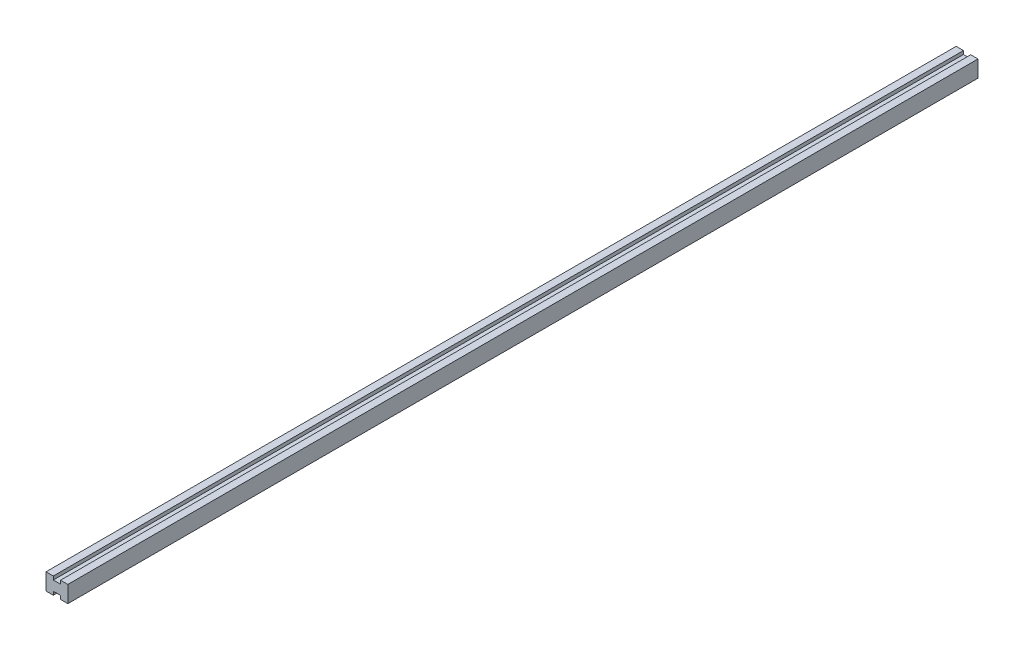
ISO-10303-21;
HEADER;
FILE_DESCRIPTION(('STEP AP214'),'2;1');
FILE_NAME('part.step','',(''),(''),'','','');
FILE_SCHEMA(('AUTOMOTIVE_DESIGN { 1 0 10303 214 1 1 1 1 }'));
ENDSEC;
DATA;
#1=APPLICATION_CONTEXT('core data for automotive mechanical design processes');
#2=APPLICATION_PROTOCOL_DEFINITION('international standard','automotive_design',2000,#1);
#3=PRODUCT_CONTEXT('',#1,'mechanical');
#4=PRODUCT('Part','Part','',(#3));
#5=PRODUCT_RELATED_PRODUCT_CATEGORY('part','',(#4));
#6=PRODUCT_DEFINITION_FORMATION('','',#4);
#7=PRODUCT_DEFINITION_CONTEXT('part definition',#1,'design');
#8=PRODUCT_DEFINITION('design','',#6,#7);
#9=PRODUCT_DEFINITION_SHAPE('','',#8);
#10=(LENGTH_UNIT() NAMED_UNIT(*) SI_UNIT(.MILLI.,.METRE.));
#11=(NAMED_UNIT(*) PLANE_ANGLE_UNIT() SI_UNIT($,.RADIAN.));
#12=(NAMED_UNIT(*) SI_UNIT($,.STERADIAN.) SOLID_ANGLE_UNIT());
#13=UNCERTAINTY_MEASURE_WITH_UNIT(LENGTH_MEASURE(1.E-05),#10,'distance_accuracy_value','');
#14=(GEOMETRIC_REPRESENTATION_CONTEXT(3) GLOBAL_UNCERTAINTY_ASSIGNED_CONTEXT((#13)) GLOBAL_UNIT_ASSIGNED_CONTEXT((#10,
#11,#12)) REPRESENTATION_CONTEXT('',''));
#15=CARTESIAN_POINT('',(0.,0.,0.));
#16=DIRECTION('',(0.,0.,1.));
#17=DIRECTION('',(1.,0.,0.));
#18=AXIS2_PLACEMENT_3D('',#15,#16,#17);
#19=CARTESIAN_POINT('',(-1.2,2.75,300.));
#20=DIRECTION('',(1.,0.,0.));
#21=DIRECTION('',(0.,1.,0.));
#22=AXIS2_PLACEMENT_3D('',#19,#20,#21);
#23=PLANE('',#22);
#24=DIRECTION('',(0.,-1.,0.));
#25=VECTOR('',#24,1.);
#26=CARTESIAN_POINT('',(-1.2,2.75,0.));
#27=LINE('',#26,#25);
#28=CARTESIAN_POINT('',(-1.2,2.75,0.));
#29=VERTEX_POINT('',#28);
#30=CARTESIAN_POINT('',(-1.2,1.6,0.));
#31=VERTEX_POINT('',#30);
#32=EDGE_CURVE('E155',#29,#31,#27,.T.);
#33=ORIENTED_EDGE('',*,*,#32,.F.);
#34=DIRECTION('',(0.,0.,-1.));
#35=VECTOR('',#34,1.);
#36=CARTESIAN_POINT('',(-1.2,2.75,300.));
#37=LINE('',#36,#35);
#38=CARTESIAN_POINT('',(-1.2,2.75,300.));
#39=VERTEX_POINT('',#38);
#40=EDGE_CURVE('E11',#39,#29,#37,.T.);
#41=ORIENTED_EDGE('',*,*,#40,.F.);
#42=DIRECTION('',(0.,-1.,0.));
#43=VECTOR('',#42,1.);
#44=CARTESIAN_POINT('',(-1.2,2.75,300.));
#45=LINE('',#44,#43);
#46=CARTESIAN_POINT('',(-1.2,1.6,300.));
#47=VERTEX_POINT('',#46);
#48=EDGE_CURVE('E183',#39,#47,#45,.T.);
#49=ORIENTED_EDGE('',*,*,#48,.T.);
#50=DIRECTION('',(0.,0.,-1.));
#51=VECTOR('',#50,1.);
#52=CARTESIAN_POINT('',(-1.2,1.6,300.));
#53=LINE('',#52,#51);
#54=EDGE_CURVE('E36',#47,#31,#53,.T.);
#55=ORIENTED_EDGE('',*,*,#54,.T.);
#56=EDGE_LOOP('',(#33,#41,#49,#55));
#57=FACE_BOUND('',#56,.T.);
#58=ADVANCED_FACE('F33',(#57),#23,.T.);
#59=CARTESIAN_POINT('',(-1.2,2.75,300.));
#60=DIRECTION('',(0.,-1.,0.));
#61=DIRECTION('',(1.,0.,0.));
#62=AXIS2_PLACEMENT_3D('',#59,#60,#61);
#63=PLANE('',#62);
#64=DIRECTION('',(-1.,0.,0.));
#65=VECTOR('',#64,1.);
#66=CARTESIAN_POINT('',(-1.2,2.75,0.));
#67=LINE('',#66,#65);
#68=CARTESIAN_POINT('',(-3.6,2.75,0.));
#69=VERTEX_POINT('',#68);
#70=EDGE_CURVE('E90',#29,#69,#67,.T.);
#71=ORIENTED_EDGE('',*,*,#70,.T.);
#72=DIRECTION('',(0.,0.,-1.));
#73=VECTOR('',#72,1.);
#74=CARTESIAN_POINT('',(-3.6,2.75,300.));
#75=LINE('',#74,#73);
#76=CARTESIAN_POINT('',(-3.6,2.75,300.));
#77=VERTEX_POINT('',#76);
#78=EDGE_CURVE('E42',#77,#69,#75,.T.);
#79=ORIENTED_EDGE('',*,*,#78,.F.);
#80=DIRECTION('',(-1.,0.,0.));
#81=VECTOR('',#80,1.);
#82=CARTESIAN_POINT('',(-1.2,2.75,300.));
#83=LINE('',#82,#81);
#84=EDGE_CURVE('E134',#39,#77,#83,.T.);
#85=ORIENTED_EDGE('',*,*,#84,.F.);
#86=ORIENTED_EDGE('',*,*,#40,.T.);
#87=EDGE_LOOP('',(#71,#79,#85,#86));
#88=FACE_BOUND('',#87,.T.);
#89=ADVANCED_FACE('F260',(#88),#63,.F.);
#90=CARTESIAN_POINT('',(-3.6,2.75,300.));
#91=DIRECTION('',(1.,0.,0.));
#92=DIRECTION('',(0.,0.,-1.));
#93=AXIS2_PLACEMENT_3D('',#90,#91,#92);
#94=PLANE('',#93);
#95=DIRECTION('',(0.,-1.,0.));
#96=VECTOR('',#95,1.);
#97=CARTESIAN_POINT('',(-3.6,2.75,0.));
#98=LINE('',#97,#96);
#99=CARTESIAN_POINT('',(-3.6,-2.75,0.));
#100=VERTEX_POINT('',#99);
#101=EDGE_CURVE('E141',#69,#100,#98,.T.);
#102=ORIENTED_EDGE('',*,*,#101,.T.);
#103=DIRECTION('',(0.,0.,-1.));
#104=VECTOR('',#103,1.);
#105=CARTESIAN_POINT('',(-3.6,-2.75,300.));
#106=LINE('',#105,#104);
#107=CARTESIAN_POINT('',(-3.6,-2.75,300.));
#108=VERTEX_POINT('',#107);
#109=EDGE_CURVE('E138',#108,#100,#106,.T.);
#110=ORIENTED_EDGE('',*,*,#109,.F.);
#111=DIRECTION('',(0.,-1.,0.));
#112=VECTOR('',#111,1.);
#113=CARTESIAN_POINT('',(-3.6,2.75,300.));
#114=LINE('',#113,#112);
#115=EDGE_CURVE('E127',#77,#108,#114,.T.);
#116=ORIENTED_EDGE('',*,*,#115,.F.);
#117=ORIENTED_EDGE('',*,*,#78,.T.);
#118=EDGE_LOOP('',(#102,#110,#116,#117));
#119=FACE_BOUND('',#118,.T.);
#120=ADVANCED_FACE('F139',(#119),#94,.F.);
#121=CARTESIAN_POINT('',(-1.2,-2.75,300.));
#122=DIRECTION('',(0.,-1.,0.));
#123=DIRECTION('',(1.,0.,0.));
#124=AXIS2_PLACEMENT_3D('',#121,#122,#123);
#125=PLANE('',#124);
#126=DIRECTION('',(-1.,0.,0.));
#127=VECTOR('',#126,1.);
#128=CARTESIAN_POINT('',(-1.2,-2.75,0.));
#129=LINE('',#128,#127);
#130=CARTESIAN_POINT('',(-1.2,-2.75,0.));
#131=VERTEX_POINT('',#130);
#132=EDGE_CURVE('E180',#131,#100,#129,.T.);
#133=ORIENTED_EDGE('',*,*,#132,.F.);
#134=DIRECTION('',(0.,0.,-1.));
#135=VECTOR('',#134,1.);
#136=CARTESIAN_POINT('',(-1.2,-2.75,300.));
#137=LINE('',#136,#135);
#138=CARTESIAN_POINT('',(-1.2,-2.75,300.));
#139=VERTEX_POINT('',#138);
#140=EDGE_CURVE('E145',#139,#131,#137,.T.);
#141=ORIENTED_EDGE('',*,*,#140,.F.);
#142=DIRECTION('',(-1.,0.,0.));
#143=VECTOR('',#142,1.);
#144=CARTESIAN_POINT('',(-1.2,-2.75,300.));
#145=LINE('',#144,#143);
#146=EDGE_CURVE('E132',#139,#108,#145,.T.);
#147=ORIENTED_EDGE('',*,*,#146,.T.);
#148=ORIENTED_EDGE('',*,*,#109,.T.);
#149=EDGE_LOOP('',(#133,#141,#147,#148));
#150=FACE_BOUND('',#149,.T.);
#151=ADVANCED_FACE('F147',(#150),#125,.T.);
#152=CARTESIAN_POINT('',(-1.2,-1.6,300.));
#153=DIRECTION('',(1.,0.,0.));
#154=DIRECTION('',(0.,0.,-1.));
#155=AXIS2_PLACEMENT_3D('',#152,#153,#154);
#156=PLANE('',#155);
#157=DIRECTION('',(0.,-1.,0.));
#158=VECTOR('',#157,1.);
#159=CARTESIAN_POINT('',(-1.2,-1.6,0.));
#160=LINE('',#159,#158);
#161=CARTESIAN_POINT('',(-1.2,-1.6,0.));
#162=VERTEX_POINT('',#161);
#163=EDGE_CURVE('E177',#162,#131,#160,.T.);
#164=ORIENTED_EDGE('',*,*,#163,.F.);
#165=DIRECTION('',(0.,0.,-1.));
#166=VECTOR('',#165,1.);
#167=CARTESIAN_POINT('',(-1.2,-1.6,300.));
#168=LINE('',#167,#166);
#169=CARTESIAN_POINT('',(-1.2,-1.6,300.));
#170=VERTEX_POINT('',#169);
#171=EDGE_CURVE('E187',#170,#162,#168,.T.);
#172=ORIENTED_EDGE('',*,*,#171,.F.);
#173=DIRECTION('',(0.,-1.,0.));
#174=VECTOR('',#173,1.);
#175=CARTESIAN_POINT('',(-1.2,-1.6,300.));
#176=LINE('',#175,#174);
#177=EDGE_CURVE('E148',#170,#139,#176,.T.);
#178=ORIENTED_EDGE('',*,*,#177,.T.);
#179=ORIENTED_EDGE('',*,*,#140,.T.);
#180=EDGE_LOOP('',(#164,#172,#178,#179));
#181=FACE_BOUND('',#180,.T.);
#182=ADVANCED_FACE('F212',(#181),#156,.T.);
#183=CARTESIAN_POINT('',(1.19999999999997,-1.60000000000001,300.));
#184=DIRECTION('',(0.,-1.,0.));
#185=DIRECTION('',(1.,0.,0.));
#186=AXIS2_PLACEMENT_3D('',#183,#184,#185);
#187=PLANE('',#186);
#188=DIRECTION('',(-1.,0.,0.));
#189=VECTOR('',#188,1.);
#190=CARTESIAN_POINT('',(1.19999999999997,-1.60000000000001,0.));
#191=LINE('',#190,#189);
#192=CARTESIAN_POINT('',(1.19999999999997,-1.60000000000001,0.));
#193=VERTEX_POINT('',#192);
#194=EDGE_CURVE('E174',#193,#162,#191,.T.);
#195=ORIENTED_EDGE('',*,*,#194,.F.);
#196=DIRECTION('',(0.,0.,-1.));
#197=VECTOR('',#196,1.);
#198=CARTESIAN_POINT('',(1.19999999999997,-1.60000000000001,300.));
#199=LINE('',#198,#197);
#200=CARTESIAN_POINT('',(1.19999999999997,-1.60000000000001,300.));
#201=VERTEX_POINT('',#200);
#202=EDGE_CURVE('E189',#201,#193,#199,.T.);
#203=ORIENTED_EDGE('',*,*,#202,.F.);
#204=DIRECTION('',(-1.,0.,0.));
#205=VECTOR('',#204,1.);
#206=CARTESIAN_POINT('',(1.19999999999997,-1.60000000000001,300.));
#207=LINE('',#206,#205);
#208=EDGE_CURVE('E150',#201,#170,#207,.T.);
#209=ORIENTED_EDGE('',*,*,#208,.T.);
#210=ORIENTED_EDGE('',*,*,#171,.T.);
#211=EDGE_LOOP('',(#195,#203,#209,#210));
#212=FACE_BOUND('',#211,.T.);
#213=ADVANCED_FACE('F216',(#212),#187,.T.);
#214=CARTESIAN_POINT('',(1.19999999999997,-1.60000000000001,300.));
#215=DIRECTION('',(1.,0.,0.));
#216=DIRECTION('',(0.,0.,-1.));
#217=AXIS2_PLACEMENT_3D('',#214,#215,#216);
#218=PLANE('',#217);
#219=DIRECTION('',(0.,-1.,0.));
#220=VECTOR('',#219,1.);
#221=CARTESIAN_POINT('',(1.19999999999997,-1.60000000000001,0.));
#222=LINE('',#221,#220);
#223=CARTESIAN_POINT('',(1.19999999999997,-2.75,0.));
#224=VERTEX_POINT('',#223);
#225=EDGE_CURVE('E172',#193,#224,#222,.T.);
#226=ORIENTED_EDGE('',*,*,#225,.T.);
#227=DIRECTION('',(0.,0.,-1.));
#228=VECTOR('',#227,1.);
#229=CARTESIAN_POINT('',(1.19999999999997,-2.75,300.));
#230=LINE('',#229,#228);
#231=CARTESIAN_POINT('',(1.19999999999997,-2.75,300.));
#232=VERTEX_POINT('',#231);
#233=EDGE_CURVE('E191',#232,#224,#230,.T.);
#234=ORIENTED_EDGE('',*,*,#233,.F.);
#235=DIRECTION('',(0.,-1.,0.));
#236=VECTOR('',#235,1.);
#237=CARTESIAN_POINT('',(1.19999999999997,-1.60000000000001,300.));
#238=LINE('',#237,#236);
#239=EDGE_CURVE('E218',#201,#232,#238,.T.);
#240=ORIENTED_EDGE('',*,*,#239,.F.);
#241=ORIENTED_EDGE('',*,*,#202,.T.);
#242=EDGE_LOOP('',(#226,#234,#240,#241));
#243=FACE_BOUND('',#242,.T.);
#244=ADVANCED_FACE('F250',(#243),#218,.F.);
#245=CARTESIAN_POINT('',(1.19999999999997,-2.75,300.));
#246=DIRECTION('',(0.,1.,0.));
#247=DIRECTION('',(0.,0.,1.));
#248=AXIS2_PLACEMENT_3D('',#245,#246,#247);
#249=PLANE('',#248);
#250=DIRECTION('',(1.,0.,0.));
#251=VECTOR('',#250,1.);
#252=CARTESIAN_POINT('',(1.19999999999997,-2.75,0.));
#253=LINE('',#252,#251);
#254=CARTESIAN_POINT('',(3.59999999999998,-2.75,0.));
#255=VERTEX_POINT('',#254);
#256=EDGE_CURVE('E169',#224,#255,#253,.T.);
#257=ORIENTED_EDGE('',*,*,#256,.T.);
#258=DIRECTION('',(0.,0.,-1.));
#259=VECTOR('',#258,1.);
#260=CARTESIAN_POINT('',(3.59999999999998,-2.75,300.));
#261=LINE('',#260,#259);
#262=CARTESIAN_POINT('',(3.59999999999998,-2.75,300.));
#263=VERTEX_POINT('',#262);
#264=EDGE_CURVE('E194',#263,#255,#261,.T.);
#265=ORIENTED_EDGE('',*,*,#264,.F.);
#266=DIRECTION('',(1.,0.,0.));
#267=VECTOR('',#266,1.);
#268=CARTESIAN_POINT('',(1.19999999999997,-2.75,300.));
#269=LINE('',#268,#267);
#270=EDGE_CURVE('E219',#232,#263,#269,.T.);
#271=ORIENTED_EDGE('',*,*,#270,.F.);
#272=ORIENTED_EDGE('',*,*,#233,.T.);
#273=EDGE_LOOP('',(#257,#265,#271,#272));
#274=FACE_BOUND('',#273,.T.);
#275=ADVANCED_FACE('F246',(#274),#249,.F.);
#276=CARTESIAN_POINT('',(3.59999999999998,2.75,300.));
#277=DIRECTION('',(1.,0.,0.));
#278=DIRECTION('',(0.,0.,-1.));
#279=AXIS2_PLACEMENT_3D('',#276,#277,#278);
#280=PLANE('',#279);
#281=DIRECTION('',(0.,-1.,0.));
#282=VECTOR('',#281,1.);
#283=CARTESIAN_POINT('',(3.59999999999998,2.75,0.));
#284=LINE('',#283,#282);
#285=CARTESIAN_POINT('',(3.59999999999998,2.75,0.));
#286=VERTEX_POINT('',#285);
#287=EDGE_CURVE('E166',#286,#255,#284,.T.);
#288=ORIENTED_EDGE('',*,*,#287,.F.);
#289=DIRECTION('',(0.,0.,-1.));
#290=VECTOR('',#289,1.);
#291=CARTESIAN_POINT('',(3.59999999999998,2.75,300.));
#292=LINE('',#291,#290);
#293=CARTESIAN_POINT('',(3.59999999999998,2.75,300.));
#294=VERTEX_POINT('',#293);
#295=EDGE_CURVE('E196',#294,#286,#292,.T.);
#296=ORIENTED_EDGE('',*,*,#295,.F.);
#297=DIRECTION('',(0.,-1.,0.));
#298=VECTOR('',#297,1.);
#299=CARTESIAN_POINT('',(3.59999999999998,2.75,300.));
#300=LINE('',#299,#298);
#301=EDGE_CURVE('E223',#294,#263,#300,.T.);
#302=ORIENTED_EDGE('',*,*,#301,.T.);
#303=ORIENTED_EDGE('',*,*,#264,.T.);
#304=EDGE_LOOP('',(#288,#296,#302,#303));
#305=FACE_BOUND('',#304,.T.);
#306=ADVANCED_FACE('F242',(#305),#280,.T.);
#307=CARTESIAN_POINT('',(1.19999999999997,2.75,300.));
#308=DIRECTION('',(0.,1.,0.));
#309=DIRECTION('',(0.,0.,1.));
#310=AXIS2_PLACEMENT_3D('',#307,#308,#309);
#311=PLANE('',#310);
#312=DIRECTION('',(1.,0.,0.));
#313=VECTOR('',#312,1.);
#314=CARTESIAN_POINT('',(1.19999999999997,2.75,0.));
#315=LINE('',#314,#313);
#316=CARTESIAN_POINT('',(1.19999999999997,2.75,0.));
#317=VERTEX_POINT('',#316);
#318=EDGE_CURVE('E163',#317,#286,#315,.T.);
#319=ORIENTED_EDGE('',*,*,#318,.F.);
#320=DIRECTION('',(0.,0.,-1.));
#321=VECTOR('',#320,1.);
#322=CARTESIAN_POINT('',(1.19999999999997,2.75,300.));
#323=LINE('',#322,#321);
#324=CARTESIAN_POINT('',(1.19999999999997,2.75,300.));
#325=VERTEX_POINT('',#324);
#326=EDGE_CURVE('E198',#325,#317,#323,.T.);
#327=ORIENTED_EDGE('',*,*,#326,.F.);
#328=DIRECTION('',(1.,0.,0.));
#329=VECTOR('',#328,1.);
#330=CARTESIAN_POINT('',(1.19999999999997,2.75,300.));
#331=LINE('',#330,#329);
#332=EDGE_CURVE('E226',#325,#294,#331,.T.);
#333=ORIENTED_EDGE('',*,*,#332,.T.);
#334=ORIENTED_EDGE('',*,*,#295,.T.);
#335=EDGE_LOOP('',(#319,#327,#333,#334));
#336=FACE_BOUND('',#335,.T.);
#337=ADVANCED_FACE('F239',(#336),#311,.T.);
#338=CARTESIAN_POINT('',(1.19999999999997,2.75,300.));
#339=DIRECTION('',(1.,0.,0.));
#340=DIRECTION('',(0.,1.,0.));
#341=AXIS2_PLACEMENT_3D('',#338,#339,#340);
#342=PLANE('',#341);
#343=DIRECTION('',(0.,-1.,0.));
#344=VECTOR('',#343,1.);
#345=CARTESIAN_POINT('',(1.19999999999997,2.75,0.));
#346=LINE('',#345,#344);
#347=CARTESIAN_POINT('',(1.19999999999997,1.6,0.));
#348=VERTEX_POINT('',#347);
#349=EDGE_CURVE('E161',#317,#348,#346,.T.);
#350=ORIENTED_EDGE('',*,*,#349,.T.);
#351=DIRECTION('',(0.,0.,-1.));
#352=VECTOR('',#351,1.);
#353=CARTESIAN_POINT('',(1.19999999999997,1.6,300.));
#354=LINE('',#353,#352);
#355=CARTESIAN_POINT('',(1.19999999999997,1.6,300.));
#356=VERTEX_POINT('',#355);
#357=EDGE_CURVE('E199',#356,#348,#354,.T.);
#358=ORIENTED_EDGE('',*,*,#357,.F.);
#359=DIRECTION('',(0.,-1.,0.));
#360=VECTOR('',#359,1.);
#361=CARTESIAN_POINT('',(1.19999999999997,2.75,300.));
#362=LINE('',#361,#360);
#363=EDGE_CURVE('E229',#325,#356,#362,.T.);
#364=ORIENTED_EDGE('',*,*,#363,.F.);
#365=ORIENTED_EDGE('',*,*,#326,.T.);
#366=EDGE_LOOP('',(#350,#358,#364,#365));
#367=FACE_BOUND('',#366,.T.);
#368=ADVANCED_FACE('F236',(#367),#342,.F.);
#369=CARTESIAN_POINT('',(1.19999999999997,1.6,300.));
#370=DIRECTION('',(0.,-1.,0.));
#371=DIRECTION('',(0.,0.,-1.));
#372=AXIS2_PLACEMENT_3D('',#369,#370,#371);
#373=PLANE('',#372);
#374=DIRECTION('',(-1.,0.,0.));
#375=VECTOR('',#374,1.);
#376=CARTESIAN_POINT('',(1.19999999999997,1.6,0.));
#377=LINE('',#376,#375);
#378=EDGE_CURVE('E158',#348,#31,#377,.T.);
#379=ORIENTED_EDGE('',*,*,#378,.T.);
#380=ORIENTED_EDGE('',*,*,#54,.F.);
#381=DIRECTION('',(-1.,0.,0.));
#382=VECTOR('',#381,1.);
#383=CARTESIAN_POINT('',(1.19999999999997,1.6,300.));
#384=LINE('',#383,#382);
#385=EDGE_CURVE('E100',#356,#47,#384,.T.);
#386=ORIENTED_EDGE('',*,*,#385,.F.);
#387=ORIENTED_EDGE('',*,*,#357,.T.);
#388=EDGE_LOOP('',(#379,#380,#386,#387));
#389=FACE_BOUND('',#388,.T.);
#390=ADVANCED_FACE('F204',(#389),#373,.F.);
#391=CARTESIAN_POINT('',(0.,0.,300.));
#392=DIRECTION('',(0.,0.,-1.));
#393=DIRECTION('',(-1.,0.,0.));
#394=AXIS2_PLACEMENT_3D('',#391,#392,#393);
#395=PLANE('',#394);
#396=ORIENTED_EDGE('',*,*,#48,.F.);
#397=ORIENTED_EDGE('',*,*,#84,.T.);
#398=ORIENTED_EDGE('',*,*,#115,.T.);
#399=ORIENTED_EDGE('',*,*,#146,.F.);
#400=ORIENTED_EDGE('',*,*,#177,.F.);
#401=ORIENTED_EDGE('',*,*,#208,.F.);
#402=ORIENTED_EDGE('',*,*,#239,.T.);
#403=ORIENTED_EDGE('',*,*,#270,.T.);
#404=ORIENTED_EDGE('',*,*,#301,.F.);
#405=ORIENTED_EDGE('',*,*,#332,.F.);
#406=ORIENTED_EDGE('',*,*,#363,.T.);
#407=ORIENTED_EDGE('',*,*,#385,.T.);
#408=EDGE_LOOP('',(#396,#397,#398,#399,#400,#401,#402,#403,#404,#405,#406,#407));
#409=FACE_BOUND('',#408,.T.);
#410=ADVANCED_FACE('F129',(#409),#395,.F.);
#411=CARTESIAN_POINT('',(0.,0.,0.));
#412=DIRECTION('',(0.,0.,-1.));
#413=DIRECTION('',(-1.,0.,0.));
#414=AXIS2_PLACEMENT_3D('',#411,#412,#413);
#415=PLANE('',#414);
#416=ORIENTED_EDGE('',*,*,#32,.T.);
#417=ORIENTED_EDGE('',*,*,#378,.F.);
#418=ORIENTED_EDGE('',*,*,#349,.F.);
#419=ORIENTED_EDGE('',*,*,#318,.T.);
#420=ORIENTED_EDGE('',*,*,#287,.T.);
#421=ORIENTED_EDGE('',*,*,#256,.F.);
#422=ORIENTED_EDGE('',*,*,#225,.F.);
#423=ORIENTED_EDGE('',*,*,#194,.T.);
#424=ORIENTED_EDGE('',*,*,#163,.T.);
#425=ORIENTED_EDGE('',*,*,#132,.T.);
#426=ORIENTED_EDGE('',*,*,#101,.F.);
#427=ORIENTED_EDGE('',*,*,#70,.F.);
#428=EDGE_LOOP('',(#416,#417,#418,#419,#420,#421,#422,#423,#424,#425,#426,#427));
#429=FACE_BOUND('',#428,.T.);
#430=ADVANCED_FACE('F207',(#429),#415,.T.);
#431=CLOSED_SHELL('',(#58,#89,#120,#151,#182,#213,#244,#275,#306,#337,#368,#390,#410,#430));
#432=MANIFOLD_SOLID_BREP('B2',#431);
#433=ADVANCED_BREP_SHAPE_REPRESENTATION('',(#18,#432),#14);
#434=SHAPE_DEFINITION_REPRESENTATION(#9,#433);
ENDSEC;
END-ISO-10303-21;
